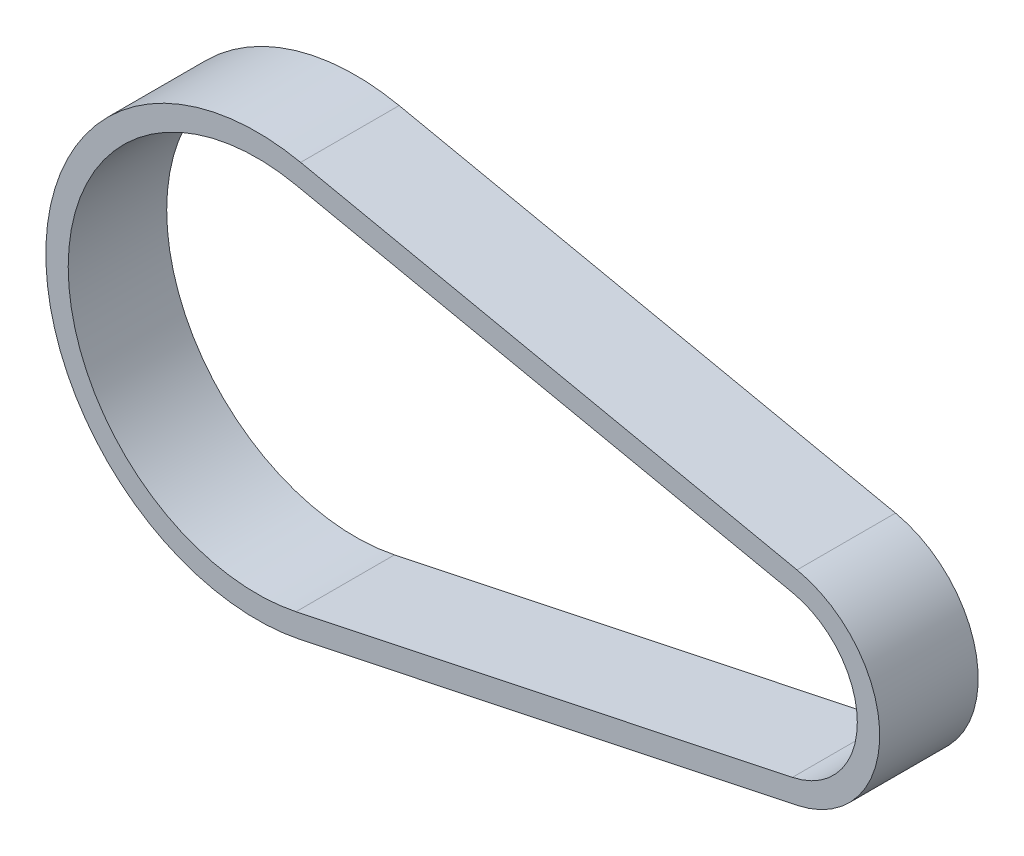
ISO-10303-21;
HEADER;
FILE_DESCRIPTION(('STEP AP214'),'2;1');
FILE_NAME('part.step','',(''),(''),'','','');
FILE_SCHEMA(('AUTOMOTIVE_DESIGN { 1 0 10303 214 1 1 1 1 }'));
ENDSEC;
DATA;
#1=APPLICATION_CONTEXT('core data for automotive mechanical design processes');
#2=APPLICATION_PROTOCOL_DEFINITION('international standard','automotive_design',2000,#1);
#3=PRODUCT_CONTEXT('',#1,'mechanical');
#4=PRODUCT('Part','Part','',(#3));
#5=PRODUCT_RELATED_PRODUCT_CATEGORY('part','',(#4));
#6=PRODUCT_DEFINITION_FORMATION('','',#4);
#7=PRODUCT_DEFINITION_CONTEXT('part definition',#1,'design');
#8=PRODUCT_DEFINITION('design','',#6,#7);
#9=PRODUCT_DEFINITION_SHAPE('','',#8);
#10=(LENGTH_UNIT() NAMED_UNIT(*) SI_UNIT(.MILLI.,.METRE.));
#11=(NAMED_UNIT(*) PLANE_ANGLE_UNIT() SI_UNIT($,.RADIAN.));
#12=(NAMED_UNIT(*) SI_UNIT($,.STERADIAN.) SOLID_ANGLE_UNIT());
#13=UNCERTAINTY_MEASURE_WITH_UNIT(LENGTH_MEASURE(1.E-05),#10,'distance_accuracy_value','');
#14=(GEOMETRIC_REPRESENTATION_CONTEXT(3) GLOBAL_UNCERTAINTY_ASSIGNED_CONTEXT((#13)) GLOBAL_UNIT_ASSIGNED_CONTEXT((#10,
#11,#12)) REPRESENTATION_CONTEXT('',''));
#15=CARTESIAN_POINT('',(0.,0.,0.));
#16=DIRECTION('',(0.,0.,1.));
#17=DIRECTION('',(1.,0.,0.));
#18=AXIS2_PLACEMENT_3D('',#15,#16,#17);
#19=CARTESIAN_POINT('',(0.,0.,11.));
#20=DIRECTION('',(0.,0.,1.));
#21=DIRECTION('',(1.,0.,0.));
#22=AXIS2_PLACEMENT_3D('',#19,#20,#21);
#23=PLANE('',#22);
#24=CARTESIAN_POINT('',(0.,0.,11.));
#25=DIRECTION('',(0.,0.,1.));
#26=DIRECTION('',(1.,0.,0.));
#27=AXIS2_PLACEMENT_3D('',#24,#25,#26);
#28=CIRCLE('',#27,23.5918791400055);
#29=CARTESIAN_POINT('',(4.87044443568059,23.0836637550362,11.));
#30=VERTEX_POINT('',#29);
#31=CARTESIAN_POINT('',(4.87044284038721,-23.0836640916288,11.));
#32=VERTEX_POINT('',#31);
#33=EDGE_CURVE('E137',#30,#32,#28,.T.);
#34=ORIENTED_EDGE('',*,*,#33,.T.);
#35=DIRECTION('',(0.978458024247154,0.206445864057279,0.));
#36=VECTOR('',#35,1.);
#37=CARTESIAN_POINT('',(4.87044284038721,-23.0836640916288,11.));
#38=LINE('',#37,#36);
#39=CARTESIAN_POINT('',(60.3142417402916,-11.385519984409,11.));
#40=VERTEX_POINT('',#39);
#41=EDGE_CURVE('E140',#32,#40,#38,.T.);
#42=ORIENTED_EDGE('',*,*,#41,.T.);
#43=CARTESIAN_POINT('',(57.9119999999999,8.34068837217081E-07,11.));
#44=DIRECTION('',(0.,0.,1.));
#45=DIRECTION('',(1.,0.,0.));
#46=AXIS2_PLACEMENT_3D('',#43,#44,#45);
#47=CIRCLE('',#46,11.6361870768216);
#48=CARTESIAN_POINT('',(60.3142417772009,11.3855216447591,11.));
#49=VERTEX_POINT('',#48);
#50=EDGE_CURVE('E143',#40,#49,#47,.T.);
#51=ORIENTED_EDGE('',*,*,#50,.T.);
#52=DIRECTION('',(-0.978458030193764,0.206445835873092,0.));
#53=VECTOR('',#52,1.);
#54=CARTESIAN_POINT('',(4.87044443568059,23.0836637550362,11.));
#55=LINE('',#54,#53);
#56=EDGE_CURVE('E145',#49,#30,#55,.T.);
#57=ORIENTED_EDGE('',*,*,#56,.T.);
#58=EDGE_LOOP('',(#34,#42,#51,#57));
#59=FACE_BOUND('',#58,.T.);
#60=DIRECTION('',(0.978458024247154,0.20644586405728,0.));
#61=VECTOR('',#60,1.);
#62=CARTESIAN_POINT('',(4.35433121365013,-20.6375183909895,11.));
#63=LINE('',#62,#61);
#64=CARTESIAN_POINT('',(4.35433121365013,-20.6375183909895,11.));
#65=VERTEX_POINT('',#64);
#66=CARTESIAN_POINT('',(59.7981280352633,-8.93937472227041,11.));
#67=VERTEX_POINT('',#66);
#68=EDGE_CURVE('E109',#65,#67,#63,.T.);
#69=ORIENTED_EDGE('',*,*,#68,.F.);
#70=CARTESIAN_POINT('',(0.,0.,11.));
#71=DIRECTION('',(0.,0.,1.));
#72=DIRECTION('',(1.,0.,0.));
#73=AXIS2_PLACEMENT_3D('',#70,#71,#72);
#74=CIRCLE('',#73,21.0918791400054);
#75=CARTESIAN_POINT('',(4.35433061919264,20.6375185164146,11.));
#76=VERTEX_POINT('',#75);
#77=EDGE_CURVE('E101',#76,#65,#74,.T.);
#78=ORIENTED_EDGE('',*,*,#77,.F.);
#79=DIRECTION('',(-0.978458030193764,0.206445835873092,0.));
#80=VECTOR('',#79,1.);
#81=CARTESIAN_POINT('',(4.35433061919264,20.6375185164146,11.));
#82=LINE('',#81,#80);
#83=CARTESIAN_POINT('',(59.7981277777673,8.93937644473743,11.));
#84=VERTEX_POINT('',#83);
#85=EDGE_CURVE('E123',#84,#76,#82,.T.);
#86=ORIENTED_EDGE('',*,*,#85,.F.);
#87=CARTESIAN_POINT('',(57.9119999999999,8.34068837217081E-07,11.));
#88=DIRECTION('',(0.,0.,1.));
#89=DIRECTION('',(1.,0.,0.));
#90=AXIS2_PLACEMENT_3D('',#87,#88,#89);
#91=CIRCLE('',#90,9.13618707682161);
#92=EDGE_CURVE('E121',#67,#84,#91,.T.);
#93=ORIENTED_EDGE('',*,*,#92,.F.);
#94=EDGE_LOOP('',(#69,#78,#86,#93));
#95=FACE_BOUND('',#94,.T.);
#96=ADVANCED_FACE('F36',(#59,#95),#23,.T.);
#97=CARTESIAN_POINT('',(0.,0.,0.));
#98=DIRECTION('',(0.,0.,1.));
#99=DIRECTION('',(1.,0.,0.));
#100=AXIS2_PLACEMENT_3D('',#97,#98,#99);
#101=PLANE('',#100);
#102=CARTESIAN_POINT('',(0.,0.,0.));
#103=DIRECTION('',(0.,0.,1.));
#104=DIRECTION('',(1.,0.,0.));
#105=AXIS2_PLACEMENT_3D('',#102,#103,#104);
#106=CIRCLE('',#105,23.5918791400055);
#107=CARTESIAN_POINT('',(4.87044443568059,23.0836637550362,0.));
#108=VERTEX_POINT('',#107);
#109=CARTESIAN_POINT('',(4.87044284038721,-23.0836640916288,0.));
#110=VERTEX_POINT('',#109);
#111=EDGE_CURVE('E117',#108,#110,#106,.T.);
#112=ORIENTED_EDGE('',*,*,#111,.F.);
#113=DIRECTION('',(-0.978458030193764,0.206445835873092,0.));
#114=VECTOR('',#113,1.);
#115=CARTESIAN_POINT('',(4.87044443568059,23.0836637550362,0.));
#116=LINE('',#115,#114);
#117=CARTESIAN_POINT('',(60.3142417772009,11.3855216447591,0.));
#118=VERTEX_POINT('',#117);
#119=EDGE_CURVE('E141',#118,#108,#116,.T.);
#120=ORIENTED_EDGE('',*,*,#119,.F.);
#121=CARTESIAN_POINT('',(57.9119999999999,8.34068837217081E-07,0.));
#122=DIRECTION('',(0.,0.,1.));
#123=DIRECTION('',(1.,0.,0.));
#124=AXIS2_PLACEMENT_3D('',#121,#122,#123);
#125=CIRCLE('',#124,11.6361870768216);
#126=CARTESIAN_POINT('',(60.3142417402916,-11.385519984409,0.));
#127=VERTEX_POINT('',#126);
#128=EDGE_CURVE('E152',#127,#118,#125,.T.);
#129=ORIENTED_EDGE('',*,*,#128,.F.);
#130=DIRECTION('',(0.978458024247154,0.206445864057279,0.));
#131=VECTOR('',#130,1.);
#132=CARTESIAN_POINT('',(4.87044284038721,-23.0836640916288,0.));
#133=LINE('',#132,#131);
#134=EDGE_CURVE('E150',#110,#127,#133,.T.);
#135=ORIENTED_EDGE('',*,*,#134,.F.);
#136=EDGE_LOOP('',(#112,#120,#129,#135));
#137=FACE_BOUND('',#136,.T.);
#138=CARTESIAN_POINT('',(0.,0.,0.));
#139=DIRECTION('',(0.,0.,1.));
#140=DIRECTION('',(1.,0.,0.));
#141=AXIS2_PLACEMENT_3D('',#138,#139,#140);
#142=CIRCLE('',#141,21.0918791400054);
#143=CARTESIAN_POINT('',(4.35433061919264,20.6375185164147,0.));
#144=VERTEX_POINT('',#143);
#145=CARTESIAN_POINT('',(4.35433121365013,-20.6375183909895,0.));
#146=VERTEX_POINT('',#145);
#147=EDGE_CURVE('E59',#144,#146,#142,.T.);
#148=ORIENTED_EDGE('',*,*,#147,.T.);
#149=DIRECTION('',(0.978458024247154,0.20644586405728,0.));
#150=VECTOR('',#149,1.);
#151=CARTESIAN_POINT('',(4.35433121365013,-20.6375183909895,0.));
#152=LINE('',#151,#150);
#153=CARTESIAN_POINT('',(59.7981280352633,-8.93937472227041,0.));
#154=VERTEX_POINT('',#153);
#155=EDGE_CURVE('E116',#146,#154,#152,.T.);
#156=ORIENTED_EDGE('',*,*,#155,.T.);
#157=CARTESIAN_POINT('',(57.9119999999999,8.34068837217081E-07,0.));
#158=DIRECTION('',(0.,0.,1.));
#159=DIRECTION('',(1.,0.,0.));
#160=AXIS2_PLACEMENT_3D('',#157,#158,#159);
#161=CIRCLE('',#160,9.13618707682161);
#162=CARTESIAN_POINT('',(59.7981277777673,8.93937644473743,0.));
#163=VERTEX_POINT('',#162);
#164=EDGE_CURVE('E129',#154,#163,#161,.T.);
#165=ORIENTED_EDGE('',*,*,#164,.T.);
#166=DIRECTION('',(-0.978458030193764,0.206445835873092,0.));
#167=VECTOR('',#166,1.);
#168=CARTESIAN_POINT('',(4.35433061919264,20.6375185164146,0.));
#169=LINE('',#168,#167);
#170=EDGE_CURVE('E110',#163,#144,#169,.T.);
#171=ORIENTED_EDGE('',*,*,#170,.T.);
#172=EDGE_LOOP('',(#148,#156,#165,#171));
#173=FACE_BOUND('',#172,.T.);
#174=ADVANCED_FACE('F170',(#137,#173),#101,.F.);
#175=CARTESIAN_POINT('',(0.,0.,11.));
#176=DIRECTION('',(0.,0.,-1.));
#177=DIRECTION('',(-1.,0.,0.));
#178=AXIS2_PLACEMENT_3D('',#175,#176,#177);
#179=CYLINDRICAL_SURFACE('',#178,23.5918791400055);
#180=ORIENTED_EDGE('',*,*,#111,.T.);
#181=DIRECTION('',(0.,0.,-1.));
#182=VECTOR('',#181,1.);
#183=CARTESIAN_POINT('',(4.87044284038721,-23.0836640916288,11.));
#184=LINE('',#183,#182);
#185=EDGE_CURVE('E11',#32,#110,#184,.T.);
#186=ORIENTED_EDGE('',*,*,#185,.F.);
#187=ORIENTED_EDGE('',*,*,#33,.F.);
#188=DIRECTION('',(0.,0.,-1.));
#189=VECTOR('',#188,1.);
#190=CARTESIAN_POINT('',(4.87044443568059,23.0836637550362,11.));
#191=LINE('',#190,#189);
#192=EDGE_CURVE('E147',#30,#108,#191,.T.);
#193=ORIENTED_EDGE('',*,*,#192,.T.);
#194=EDGE_LOOP('',(#180,#186,#187,#193));
#195=FACE_BOUND('',#194,.T.);
#196=ADVANCED_FACE('F38',(#195),#179,.T.);
#197=CARTESIAN_POINT('',(4.87044284038721,-23.0836640916288,11.));
#198=DIRECTION('',(-0.206445864057279,0.978458024247154,0.));
#199=DIRECTION('',(-0.978458024247154,-0.206445864057279,0.));
#200=AXIS2_PLACEMENT_3D('',#197,#198,#199);
#201=PLANE('',#200);
#202=ORIENTED_EDGE('',*,*,#134,.T.);
#203=DIRECTION('',(0.,0.,-1.));
#204=VECTOR('',#203,1.);
#205=CARTESIAN_POINT('',(60.3142417402916,-11.385519984409,11.));
#206=LINE('',#205,#204);
#207=EDGE_CURVE('E44',#40,#127,#206,.T.);
#208=ORIENTED_EDGE('',*,*,#207,.F.);
#209=ORIENTED_EDGE('',*,*,#41,.F.);
#210=ORIENTED_EDGE('',*,*,#185,.T.);
#211=EDGE_LOOP('',(#202,#208,#209,#210));
#212=FACE_BOUND('',#211,.T.);
#213=ADVANCED_FACE('F180',(#212),#201,.F.);
#214=CARTESIAN_POINT('',(57.9119999999999,8.34068837217081E-07,11.));
#215=DIRECTION('',(0.,0.,-1.));
#216=DIRECTION('',(-1.,0.,0.));
#217=AXIS2_PLACEMENT_3D('',#214,#215,#216);
#218=CYLINDRICAL_SURFACE('',#217,11.6361870768216);
#219=ORIENTED_EDGE('',*,*,#128,.T.);
#220=DIRECTION('',(0.,0.,-1.));
#221=VECTOR('',#220,1.);
#222=CARTESIAN_POINT('',(60.3142417772009,11.3855216447591,11.));
#223=LINE('',#222,#221);
#224=EDGE_CURVE('E157',#49,#118,#223,.T.);
#225=ORIENTED_EDGE('',*,*,#224,.F.);
#226=ORIENTED_EDGE('',*,*,#50,.F.);
#227=ORIENTED_EDGE('',*,*,#207,.T.);
#228=EDGE_LOOP('',(#219,#225,#226,#227));
#229=FACE_BOUND('',#228,.T.);
#230=ADVANCED_FACE('F164',(#229),#218,.T.);
#231=CARTESIAN_POINT('',(4.87044443568059,23.0836637550362,11.));
#232=DIRECTION('',(-0.206445835873092,-0.978458030193764,0.));
#233=DIRECTION('',(0.978458030193764,-0.206445835873092,0.));
#234=AXIS2_PLACEMENT_3D('',#231,#232,#233);
#235=PLANE('',#234);
#236=ORIENTED_EDGE('',*,*,#119,.T.);
#237=ORIENTED_EDGE('',*,*,#192,.F.);
#238=ORIENTED_EDGE('',*,*,#56,.F.);
#239=ORIENTED_EDGE('',*,*,#224,.T.);
#240=EDGE_LOOP('',(#236,#237,#238,#239));
#241=FACE_BOUND('',#240,.T.);
#242=ADVANCED_FACE('F174',(#241),#235,.F.);
#243=CARTESIAN_POINT('',(0.,0.,11.));
#244=DIRECTION('',(0.,0.,-1.));
#245=DIRECTION('',(-1.,0.,0.));
#246=AXIS2_PLACEMENT_3D('',#243,#244,#245);
#247=CYLINDRICAL_SURFACE('',#246,21.0918791400054);
#248=ORIENTED_EDGE('',*,*,#147,.F.);
#249=DIRECTION('',(0.,0.,-1.));
#250=VECTOR('',#249,1.);
#251=CARTESIAN_POINT('',(4.35433061919264,20.6375185164146,11.));
#252=LINE('',#251,#250);
#253=EDGE_CURVE('E105',#76,#144,#252,.T.);
#254=ORIENTED_EDGE('',*,*,#253,.F.);
#255=ORIENTED_EDGE('',*,*,#77,.T.);
#256=DIRECTION('',(0.,0.,-1.));
#257=VECTOR('',#256,1.);
#258=CARTESIAN_POINT('',(4.35433121365013,-20.6375183909895,11.));
#259=LINE('',#258,#257);
#260=EDGE_CURVE('E104',#65,#146,#259,.T.);
#261=ORIENTED_EDGE('',*,*,#260,.T.);
#262=EDGE_LOOP('',(#248,#254,#255,#261));
#263=FACE_BOUND('',#262,.T.);
#264=ADVANCED_FACE('F103',(#263),#247,.F.);
#265=CARTESIAN_POINT('',(4.35433121365013,-20.6375183909895,11.));
#266=DIRECTION('',(-0.20644586405728,0.978458024247154,0.));
#267=DIRECTION('',(-0.978458024247154,-0.20644586405728,0.));
#268=AXIS2_PLACEMENT_3D('',#265,#266,#267);
#269=PLANE('',#268);
#270=ORIENTED_EDGE('',*,*,#155,.F.);
#271=ORIENTED_EDGE('',*,*,#260,.F.);
#272=ORIENTED_EDGE('',*,*,#68,.T.);
#273=DIRECTION('',(0.,0.,-1.));
#274=VECTOR('',#273,1.);
#275=CARTESIAN_POINT('',(59.7981280352633,-8.93937472227041,11.));
#276=LINE('',#275,#274);
#277=EDGE_CURVE('E118',#67,#154,#276,.T.);
#278=ORIENTED_EDGE('',*,*,#277,.T.);
#279=EDGE_LOOP('',(#270,#271,#272,#278));
#280=FACE_BOUND('',#279,.T.);
#281=ADVANCED_FACE('F113',(#280),#269,.T.);
#282=CARTESIAN_POINT('',(57.9119999999999,8.34068837217081E-07,11.));
#283=DIRECTION('',(0.,0.,-1.));
#284=DIRECTION('',(-1.,0.,0.));
#285=AXIS2_PLACEMENT_3D('',#282,#283,#284);
#286=CYLINDRICAL_SURFACE('',#285,9.13618707682161);
#287=ORIENTED_EDGE('',*,*,#164,.F.);
#288=ORIENTED_EDGE('',*,*,#277,.F.);
#289=ORIENTED_EDGE('',*,*,#92,.T.);
#290=DIRECTION('',(0.,0.,-1.));
#291=VECTOR('',#290,1.);
#292=CARTESIAN_POINT('',(59.7981277777673,8.93937644473743,11.));
#293=LINE('',#292,#291);
#294=EDGE_CURVE('E51',#84,#163,#293,.T.);
#295=ORIENTED_EDGE('',*,*,#294,.T.);
#296=EDGE_LOOP('',(#287,#288,#289,#295));
#297=FACE_BOUND('',#296,.T.);
#298=ADVANCED_FACE('F203',(#297),#286,.F.);
#299=CARTESIAN_POINT('',(4.35433061919264,20.6375185164146,11.));
#300=DIRECTION('',(-0.206445835873092,-0.978458030193764,0.));
#301=DIRECTION('',(0.978458030193764,-0.206445835873092,0.));
#302=AXIS2_PLACEMENT_3D('',#299,#300,#301);
#303=PLANE('',#302);
#304=ORIENTED_EDGE('',*,*,#170,.F.);
#305=ORIENTED_EDGE('',*,*,#294,.F.);
#306=ORIENTED_EDGE('',*,*,#85,.T.);
#307=ORIENTED_EDGE('',*,*,#253,.T.);
#308=EDGE_LOOP('',(#304,#305,#306,#307));
#309=FACE_BOUND('',#308,.T.);
#310=ADVANCED_FACE('F207',(#309),#303,.T.);
#311=CLOSED_SHELL('',(#96,#174,#196,#213,#230,#242,#264,#281,#298,#310));
#312=MANIFOLD_SOLID_BREP('B2',#311);
#313=ADVANCED_BREP_SHAPE_REPRESENTATION('',(#18,#312),#14);
#314=SHAPE_DEFINITION_REPRESENTATION(#9,#313);
ENDSEC;
END-ISO-10303-21;
